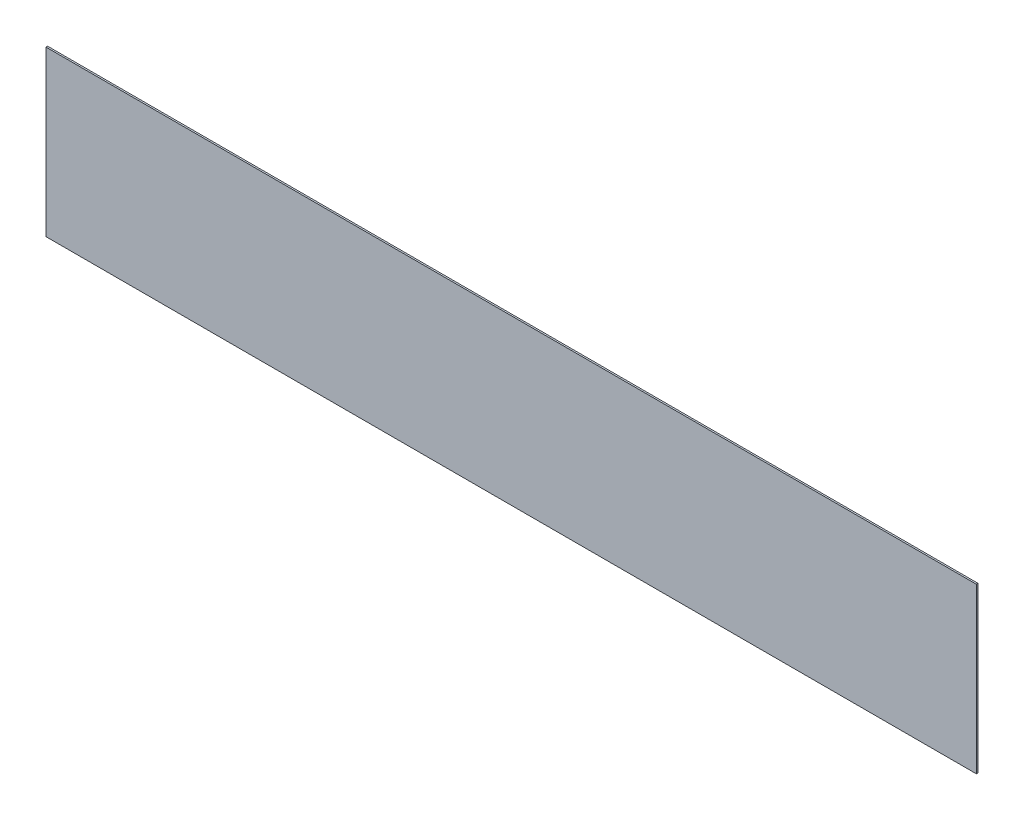
ISO-10303-21;
HEADER;
FILE_DESCRIPTION(('STEP AP214'),'2;1');
FILE_NAME('part.step','',(''),(''),'','','');
FILE_SCHEMA(('AUTOMOTIVE_DESIGN { 1 0 10303 214 1 1 1 1 }'));
ENDSEC;
DATA;
#1=APPLICATION_CONTEXT('core data for automotive mechanical design processes');
#2=APPLICATION_PROTOCOL_DEFINITION('international standard','automotive_design',2000,#1);
#3=PRODUCT_CONTEXT('',#1,'mechanical');
#4=PRODUCT('Part','Part','',(#3));
#5=PRODUCT_RELATED_PRODUCT_CATEGORY('part','',(#4));
#6=PRODUCT_DEFINITION_FORMATION('','',#4);
#7=PRODUCT_DEFINITION_CONTEXT('part definition',#1,'design');
#8=PRODUCT_DEFINITION('design','',#6,#7);
#9=PRODUCT_DEFINITION_SHAPE('','',#8);
#10=(LENGTH_UNIT() NAMED_UNIT(*) SI_UNIT(.MILLI.,.METRE.));
#11=(NAMED_UNIT(*) PLANE_ANGLE_UNIT() SI_UNIT($,.RADIAN.));
#12=(NAMED_UNIT(*) SI_UNIT($,.STERADIAN.) SOLID_ANGLE_UNIT());
#13=UNCERTAINTY_MEASURE_WITH_UNIT(LENGTH_MEASURE(1.E-05),#10,'distance_accuracy_value','');
#14=(GEOMETRIC_REPRESENTATION_CONTEXT(3) GLOBAL_UNCERTAINTY_ASSIGNED_CONTEXT((#13)) GLOBAL_UNIT_ASSIGNED_CONTEXT((#10,
#11,#12)) REPRESENTATION_CONTEXT('',''));
#15=CARTESIAN_POINT('',(0.,0.,0.));
#16=DIRECTION('',(0.,0.,1.));
#17=DIRECTION('',(1.,0.,0.));
#18=AXIS2_PLACEMENT_3D('',#15,#16,#17);
#19=CARTESIAN_POINT('',(-564.609045237222,382.107159085957,6.));
#20=DIRECTION('',(1.,0.,0.));
#21=DIRECTION('',(0.,0.,-1.));
#22=AXIS2_PLACEMENT_3D('',#19,#20,#21);
#23=PLANE('',#22);
#24=DIRECTION('',(0.,-1.,0.));
#25=VECTOR('',#24,1.);
#26=CARTESIAN_POINT('',(-564.609045237222,382.107159085957,0.));
#27=LINE('',#26,#25);
#28=CARTESIAN_POINT('',(-564.609045237222,382.107159085957,0.));
#29=VERTEX_POINT('',#28);
#30=CARTESIAN_POINT('',(-564.609045237222,-217.892840914043,0.));
#31=VERTEX_POINT('',#30);
#32=EDGE_CURVE('E96',#29,#31,#27,.T.);
#33=ORIENTED_EDGE('',*,*,#32,.T.);
#34=DIRECTION('',(0.,0.,-1.));
#35=VECTOR('',#34,1.);
#36=CARTESIAN_POINT('',(-564.609045237222,-217.892840914043,6.));
#37=LINE('',#36,#35);
#38=CARTESIAN_POINT('',(-564.609045237222,-217.892840914043,6.));
#39=VERTEX_POINT('',#38);
#40=EDGE_CURVE('E11',#39,#31,#37,.T.);
#41=ORIENTED_EDGE('',*,*,#40,.F.);
#42=DIRECTION('',(0.,-1.,0.));
#43=VECTOR('',#42,1.);
#44=CARTESIAN_POINT('',(-564.609045237222,382.107159085957,6.));
#45=LINE('',#44,#43);
#46=CARTESIAN_POINT('',(-564.609045237222,382.107159085957,6.));
#47=VERTEX_POINT('',#46);
#48=EDGE_CURVE('E84',#47,#39,#45,.T.);
#49=ORIENTED_EDGE('',*,*,#48,.F.);
#50=DIRECTION('',(0.,0.,-1.));
#51=VECTOR('',#50,1.);
#52=CARTESIAN_POINT('',(-564.609045237222,382.107159085957,6.));
#53=LINE('',#52,#51);
#54=EDGE_CURVE('E92',#47,#29,#53,.T.);
#55=ORIENTED_EDGE('',*,*,#54,.T.);
#56=EDGE_LOOP('',(#33,#41,#49,#55));
#57=FACE_BOUND('',#56,.T.);
#58=ADVANCED_FACE('F33',(#57),#23,.F.);
#59=CARTESIAN_POINT('',(-564.609045237222,-217.892840914043,6.));
#60=DIRECTION('',(0.,1.,0.));
#61=DIRECTION('',(0.,0.,1.));
#62=AXIS2_PLACEMENT_3D('',#59,#60,#61);
#63=PLANE('',#62);
#64=DIRECTION('',(1.,0.,0.));
#65=VECTOR('',#64,1.);
#66=CARTESIAN_POINT('',(-564.609045237222,-217.892840914043,0.));
#67=LINE('',#66,#65);
#68=CARTESIAN_POINT('',(2835.39095476278,-217.892840914043,0.));
#69=VERTEX_POINT('',#68);
#70=EDGE_CURVE('E88',#31,#69,#67,.T.);
#71=ORIENTED_EDGE('',*,*,#70,.T.);
#72=DIRECTION('',(0.,0.,-1.));
#73=VECTOR('',#72,1.);
#74=CARTESIAN_POINT('',(2835.39095476278,-217.892840914043,6.));
#75=LINE('',#74,#73);
#76=CARTESIAN_POINT('',(2835.39095476278,-217.892840914043,6.));
#77=VERTEX_POINT('',#76);
#78=EDGE_CURVE('E41',#77,#69,#75,.T.);
#79=ORIENTED_EDGE('',*,*,#78,.F.);
#80=DIRECTION('',(1.,0.,0.));
#81=VECTOR('',#80,1.);
#82=CARTESIAN_POINT('',(-564.609045237222,-217.892840914043,6.));
#83=LINE('',#82,#81);
#84=EDGE_CURVE('E79',#39,#77,#83,.T.);
#85=ORIENTED_EDGE('',*,*,#84,.F.);
#86=ORIENTED_EDGE('',*,*,#40,.T.);
#87=EDGE_LOOP('',(#71,#79,#85,#86));
#88=FACE_BOUND('',#87,.T.);
#89=ADVANCED_FACE('F87',(#88),#63,.F.);
#90=CARTESIAN_POINT('',(2835.39095476278,382.107159085957,6.));
#91=DIRECTION('',(-1.,0.,0.));
#92=DIRECTION('',(0.,0.,1.));
#93=AXIS2_PLACEMENT_3D('',#90,#91,#92);
#94=PLANE('',#93);
#95=DIRECTION('',(0.,1.,0.));
#96=VECTOR('',#95,1.);
#97=CARTESIAN_POINT('',(2835.39095476278,382.107159085957,0.));
#98=LINE('',#97,#96);
#99=CARTESIAN_POINT('',(2835.39095476278,382.107159085957,0.));
#100=VERTEX_POINT('',#99);
#101=EDGE_CURVE('E66',#69,#100,#98,.T.);
#102=ORIENTED_EDGE('',*,*,#101,.T.);
#103=DIRECTION('',(0.,0.,-1.));
#104=VECTOR('',#103,1.);
#105=CARTESIAN_POINT('',(2835.39095476278,382.107159085957,6.));
#106=LINE('',#105,#104);
#107=CARTESIAN_POINT('',(2835.39095476278,382.107159085957,6.));
#108=VERTEX_POINT('',#107);
#109=EDGE_CURVE('E89',#108,#100,#106,.T.);
#110=ORIENTED_EDGE('',*,*,#109,.F.);
#111=DIRECTION('',(0.,1.,0.));
#112=VECTOR('',#111,1.);
#113=CARTESIAN_POINT('',(2835.39095476278,382.107159085957,6.));
#114=LINE('',#113,#112);
#115=EDGE_CURVE('E82',#77,#108,#114,.T.);
#116=ORIENTED_EDGE('',*,*,#115,.F.);
#117=ORIENTED_EDGE('',*,*,#78,.T.);
#118=EDGE_LOOP('',(#102,#110,#116,#117));
#119=FACE_BOUND('',#118,.T.);
#120=ADVANCED_FACE('F90',(#119),#94,.F.);
#121=CARTESIAN_POINT('',(-564.609045237222,382.107159085957,6.));
#122=DIRECTION('',(0.,-1.,0.));
#123=DIRECTION('',(0.,0.,-1.));
#124=AXIS2_PLACEMENT_3D('',#121,#122,#123);
#125=PLANE('',#124);
#126=DIRECTION('',(-1.,0.,0.));
#127=VECTOR('',#126,1.);
#128=CARTESIAN_POINT('',(-564.609045237222,382.107159085957,0.));
#129=LINE('',#128,#127);
#130=EDGE_CURVE('E72',#100,#29,#129,.T.);
#131=ORIENTED_EDGE('',*,*,#130,.T.);
#132=ORIENTED_EDGE('',*,*,#54,.F.);
#133=DIRECTION('',(-1.,0.,0.));
#134=VECTOR('',#133,1.);
#135=CARTESIAN_POINT('',(-564.609045237222,382.107159085957,6.));
#136=LINE('',#135,#134);
#137=EDGE_CURVE('E49',#108,#47,#136,.T.);
#138=ORIENTED_EDGE('',*,*,#137,.F.);
#139=ORIENTED_EDGE('',*,*,#109,.T.);
#140=EDGE_LOOP('',(#131,#132,#138,#139));
#141=FACE_BOUND('',#140,.T.);
#142=ADVANCED_FACE('F103',(#141),#125,.F.);
#143=CARTESIAN_POINT('',(0.,0.,6.));
#144=DIRECTION('',(0.,0.,1.));
#145=DIRECTION('',(1.,0.,0.));
#146=AXIS2_PLACEMENT_3D('',#143,#144,#145);
#147=PLANE('',#146);
#148=ORIENTED_EDGE('',*,*,#48,.T.);
#149=ORIENTED_EDGE('',*,*,#84,.T.);
#150=ORIENTED_EDGE('',*,*,#115,.T.);
#151=ORIENTED_EDGE('',*,*,#137,.T.);
#152=EDGE_LOOP('',(#148,#149,#150,#151));
#153=FACE_BOUND('',#152,.T.);
#154=ADVANCED_FACE('F80',(#153),#147,.T.);
#155=CARTESIAN_POINT('',(0.,0.,0.));
#156=DIRECTION('',(0.,0.,1.));
#157=DIRECTION('',(1.,0.,0.));
#158=AXIS2_PLACEMENT_3D('',#155,#156,#157);
#159=PLANE('',#158);
#160=ORIENTED_EDGE('',*,*,#32,.F.);
#161=ORIENTED_EDGE('',*,*,#130,.F.);
#162=ORIENTED_EDGE('',*,*,#101,.F.);
#163=ORIENTED_EDGE('',*,*,#70,.F.);
#164=EDGE_LOOP('',(#160,#161,#162,#163));
#165=FACE_BOUND('',#164,.T.);
#166=ADVANCED_FACE('F106',(#165),#159,.F.);
#167=CLOSED_SHELL('',(#58,#89,#120,#142,#154,#166));
#168=MANIFOLD_SOLID_BREP('B2',#167);
#169=ADVANCED_BREP_SHAPE_REPRESENTATION('',(#18,#168),#14);
#170=SHAPE_DEFINITION_REPRESENTATION(#9,#169);
ENDSEC;
END-ISO-10303-21;
